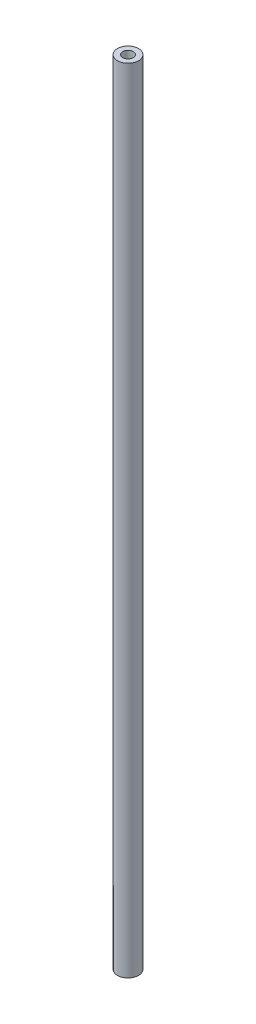
ISO-10303-21;
HEADER;
FILE_DESCRIPTION(('STEP AP214'),'2;1');
FILE_NAME('part.step','',(''),(''),'','','');
FILE_SCHEMA(('AUTOMOTIVE_DESIGN { 1 0 10303 214 1 1 1 1 }'));
ENDSEC;
DATA;
#1=APPLICATION_CONTEXT('core data for automotive mechanical design processes');
#2=APPLICATION_PROTOCOL_DEFINITION('international standard','automotive_design',2000,#1);
#3=PRODUCT_CONTEXT('',#1,'mechanical');
#4=PRODUCT('Part','Part','',(#3));
#5=PRODUCT_RELATED_PRODUCT_CATEGORY('part','',(#4));
#6=PRODUCT_DEFINITION_FORMATION('','',#4);
#7=PRODUCT_DEFINITION_CONTEXT('part definition',#1,'design');
#8=PRODUCT_DEFINITION('design','',#6,#7);
#9=PRODUCT_DEFINITION_SHAPE('','',#8);
#10=(LENGTH_UNIT() NAMED_UNIT(*) SI_UNIT(.MILLI.,.METRE.));
#11=(NAMED_UNIT(*) PLANE_ANGLE_UNIT() SI_UNIT($,.RADIAN.));
#12=(NAMED_UNIT(*) SI_UNIT($,.STERADIAN.) SOLID_ANGLE_UNIT());
#13=UNCERTAINTY_MEASURE_WITH_UNIT(LENGTH_MEASURE(1.E-05),#10,'distance_accuracy_value','');
#14=(GEOMETRIC_REPRESENTATION_CONTEXT(3) GLOBAL_UNCERTAINTY_ASSIGNED_CONTEXT((#13)) GLOBAL_UNIT_ASSIGNED_CONTEXT((#10,
#11,#12)) REPRESENTATION_CONTEXT('',''));
#15=CARTESIAN_POINT('',(0.,0.,0.));
#16=DIRECTION('',(0.,0.,1.));
#17=DIRECTION('',(1.,0.,0.));
#18=AXIS2_PLACEMENT_3D('',#15,#16,#17);
#19=CARTESIAN_POINT('',(0.,7.62,0.));
#20=DIRECTION('',(0.,1.,0.));
#21=DIRECTION('',(0.,0.,1.));
#22=AXIS2_PLACEMENT_3D('',#19,#20,#21);
#23=PLANE('',#22);
#24=CARTESIAN_POINT('',(0.,7.62,0.));
#25=DIRECTION('',(0.,1.,0.));
#26=DIRECTION('',(0.,0.,1.));
#27=AXIS2_PLACEMENT_3D('',#24,#25,#26);
#28=CIRCLE('',#27,0.1016);
#29=CARTESIAN_POINT('',(0.,7.62,0.1016));
#30=VERTEX_POINT('',#29);
#31=EDGE_CURVE('E10',#30,#30,#28,.T.);
#32=ORIENTED_EDGE('',*,*,#31,.T.);
#33=EDGE_LOOP('',(#32));
#34=FACE_BOUND('',#33,.T.);
#35=CARTESIAN_POINT('',(0.,7.62,0.));
#36=DIRECTION('',(0.,1.,0.));
#37=DIRECTION('',(0.,0.,1.));
#38=AXIS2_PLACEMENT_3D('',#35,#36,#37);
#39=CIRCLE('',#38,0.0508);
#40=CARTESIAN_POINT('',(0.,7.62,0.0508));
#41=VERTEX_POINT('',#40);
#42=EDGE_CURVE('E46',#41,#41,#39,.T.);
#43=ORIENTED_EDGE('',*,*,#42,.F.);
#44=EDGE_LOOP('',(#43));
#45=FACE_BOUND('',#44,.T.);
#46=ADVANCED_FACE('F35',(#34,#45),#23,.T.);
#47=CARTESIAN_POINT('',(0.,0.,0.));
#48=DIRECTION('',(0.,1.,0.));
#49=DIRECTION('',(0.,0.,1.));
#50=AXIS2_PLACEMENT_3D('',#47,#48,#49);
#51=PLANE('',#50);
#52=CARTESIAN_POINT('',(0.,0.,0.));
#53=DIRECTION('',(0.,1.,0.));
#54=DIRECTION('',(0.,0.,1.));
#55=AXIS2_PLACEMENT_3D('',#52,#53,#54);
#56=CIRCLE('',#55,0.1016);
#57=CARTESIAN_POINT('',(0.,0.,0.1016));
#58=VERTEX_POINT('',#57);
#59=EDGE_CURVE('E39',#58,#58,#56,.T.);
#60=ORIENTED_EDGE('',*,*,#59,.F.);
#61=EDGE_LOOP('',(#60));
#62=FACE_BOUND('',#61,.T.);
#63=CARTESIAN_POINT('',(0.,0.,0.));
#64=DIRECTION('',(0.,1.,0.));
#65=DIRECTION('',(0.,0.,1.));
#66=AXIS2_PLACEMENT_3D('',#63,#64,#65);
#67=CIRCLE('',#66,0.0508);
#68=CARTESIAN_POINT('',(0.,0.,0.0508));
#69=VERTEX_POINT('',#68);
#70=EDGE_CURVE('E48',#69,#69,#67,.T.);
#71=ORIENTED_EDGE('',*,*,#70,.T.);
#72=EDGE_LOOP('',(#71));
#73=FACE_BOUND('',#72,.T.);
#74=ADVANCED_FACE('F58',(#62,#73),#51,.F.);
#75=CARTESIAN_POINT('',(0.,7.62,0.));
#76=DIRECTION('',(0.,-1.,0.));
#77=DIRECTION('',(0.,0.,-1.));
#78=AXIS2_PLACEMENT_3D('',#75,#76,#77);
#79=CYLINDRICAL_SURFACE('',#78,0.1016);
#80=ORIENTED_EDGE('',*,*,#31,.F.);
#81=EDGE_LOOP('',(#80));
#82=FACE_BOUND('',#81,.T.);
#83=ORIENTED_EDGE('',*,*,#59,.T.);
#84=EDGE_LOOP('',(#83));
#85=FACE_BOUND('',#84,.T.);
#86=ADVANCED_FACE('F37',(#82,#85),#79,.T.);
#87=CARTESIAN_POINT('',(0.,7.62,0.));
#88=DIRECTION('',(0.,-1.,0.));
#89=DIRECTION('',(0.,0.,-1.));
#90=AXIS2_PLACEMENT_3D('',#87,#88,#89);
#91=CYLINDRICAL_SURFACE('',#90,0.0508);
#92=ORIENTED_EDGE('',*,*,#42,.T.);
#93=EDGE_LOOP('',(#92));
#94=FACE_BOUND('',#93,.T.);
#95=ORIENTED_EDGE('',*,*,#70,.F.);
#96=EDGE_LOOP('',(#95));
#97=FACE_BOUND('',#96,.T.);
#98=ADVANCED_FACE('F54',(#94,#97),#91,.F.);
#99=CLOSED_SHELL('',(#46,#74,#86,#98));
#100=MANIFOLD_SOLID_BREP('B2',#99);
#101=ADVANCED_BREP_SHAPE_REPRESENTATION('',(#18,#100),#14);
#102=SHAPE_DEFINITION_REPRESENTATION(#9,#101);
ENDSEC;
END-ISO-10303-21;
